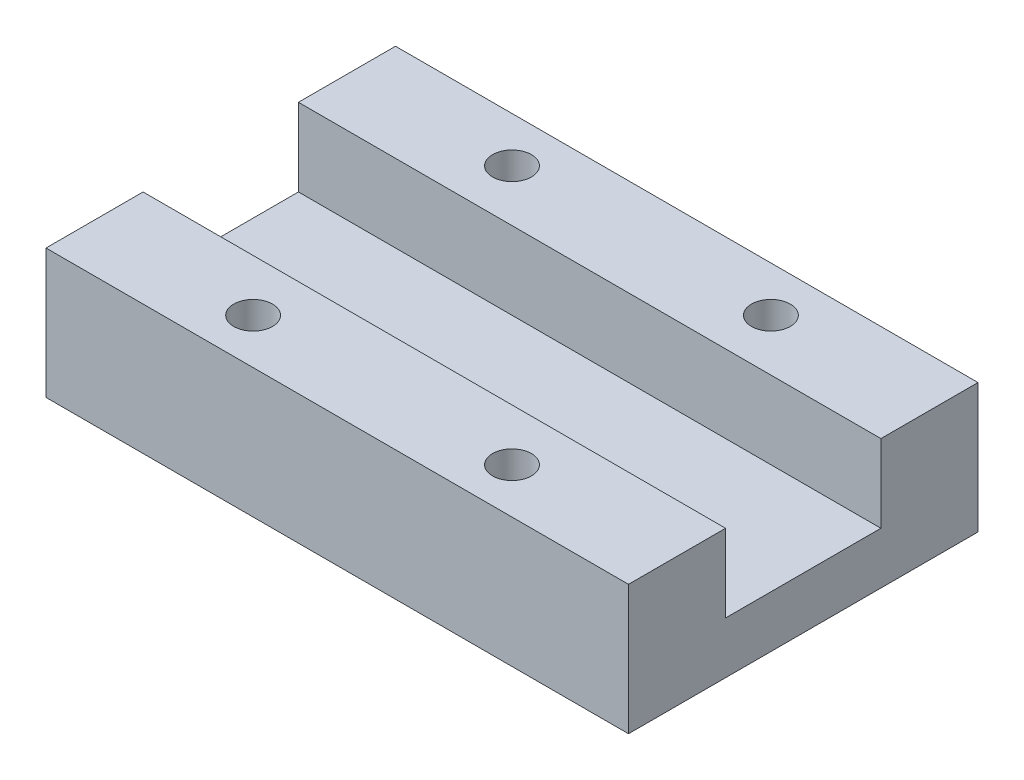
ISO-10303-21;
HEADER;
FILE_DESCRIPTION(('STEP AP214'),'2;1');
FILE_NAME('part.step','',(''),(''),'','','');
FILE_SCHEMA(('AUTOMOTIVE_DESIGN { 1 0 10303 214 1 1 1 1 }'));
ENDSEC;
DATA;
#1=APPLICATION_CONTEXT('core data for automotive mechanical design processes');
#2=APPLICATION_PROTOCOL_DEFINITION('international standard','automotive_design',2000,#1);
#3=PRODUCT_CONTEXT('',#1,'mechanical');
#4=PRODUCT('Part','Part','',(#3));
#5=PRODUCT_RELATED_PRODUCT_CATEGORY('part','',(#4));
#6=PRODUCT_DEFINITION_FORMATION('','',#4);
#7=PRODUCT_DEFINITION_CONTEXT('part definition',#1,'design');
#8=PRODUCT_DEFINITION('design','',#6,#7);
#9=PRODUCT_DEFINITION_SHAPE('','',#8);
#10=(LENGTH_UNIT() NAMED_UNIT(*) SI_UNIT(.MILLI.,.METRE.));
#11=(NAMED_UNIT(*) PLANE_ANGLE_UNIT() SI_UNIT($,.RADIAN.));
#12=(NAMED_UNIT(*) SI_UNIT($,.STERADIAN.) SOLID_ANGLE_UNIT());
#13=UNCERTAINTY_MEASURE_WITH_UNIT(LENGTH_MEASURE(1.E-05),#10,'distance_accuracy_value','');
#14=(GEOMETRIC_REPRESENTATION_CONTEXT(3) GLOBAL_UNCERTAINTY_ASSIGNED_CONTEXT((#13)) GLOBAL_UNIT_ASSIGNED_CONTEXT((#10,
#11,#12)) REPRESENTATION_CONTEXT('',''));
#15=CARTESIAN_POINT('',(0.,0.,0.));
#16=DIRECTION('',(0.,0.,1.));
#17=DIRECTION('',(1.,0.,0.));
#18=AXIS2_PLACEMENT_3D('',#15,#16,#17);
#19=CARTESIAN_POINT('',(45.,10.,0.));
#20=DIRECTION('',(0.,0.,-1.));
#21=DIRECTION('',(-1.,0.,0.));
#22=AXIS2_PLACEMENT_3D('',#19,#20,#21);
#23=PLANE('',#22);
#24=DIRECTION('',(0.,-1.,0.));
#25=VECTOR('',#24,1.);
#26=CARTESIAN_POINT('',(0.,10.,0.));
#27=LINE('',#26,#25);
#28=CARTESIAN_POINT('',(0.,10.,0.));
#29=VERTEX_POINT('',#28);
#30=CARTESIAN_POINT('',(0.,0.,0.));
#31=VERTEX_POINT('',#30);
#32=EDGE_CURVE('E148',#29,#31,#27,.T.);
#33=ORIENTED_EDGE('',*,*,#32,.T.);
#34=DIRECTION('',(-1.,0.,0.));
#35=VECTOR('',#34,1.);
#36=CARTESIAN_POINT('',(45.,0.,0.));
#37=LINE('',#36,#35);
#38=CARTESIAN_POINT('',(45.,0.,0.));
#39=VERTEX_POINT('',#38);
#40=EDGE_CURVE('E11',#39,#31,#37,.T.);
#41=ORIENTED_EDGE('',*,*,#40,.F.);
#42=DIRECTION('',(0.,-1.,0.));
#43=VECTOR('',#42,1.);
#44=CARTESIAN_POINT('',(45.,10.,0.));
#45=LINE('',#44,#43);
#46=CARTESIAN_POINT('',(45.,10.,0.));
#47=VERTEX_POINT('',#46);
#48=EDGE_CURVE('E170',#47,#39,#45,.T.);
#49=ORIENTED_EDGE('',*,*,#48,.F.);
#50=DIRECTION('',(-1.,0.,0.));
#51=VECTOR('',#50,1.);
#52=CARTESIAN_POINT('',(45.,10.,0.));
#53=LINE('',#52,#51);
#54=EDGE_CURVE('E144',#47,#29,#53,.T.);
#55=ORIENTED_EDGE('',*,*,#54,.T.);
#56=EDGE_LOOP('',(#33,#41,#49,#55));
#57=FACE_BOUND('',#56,.T.);
#58=ADVANCED_FACE('F45',(#57),#23,.F.);
#59=CARTESIAN_POINT('',(45.,0.,0.));
#60=DIRECTION('',(0.,1.,0.));
#61=DIRECTION('',(0.,0.,1.));
#62=AXIS2_PLACEMENT_3D('',#59,#60,#61);
#63=PLANE('',#62);
#64=CARTESIAN_POINT('',(12.5,0.,-3.5));
#65=DIRECTION('',(0.,-1.,0.));
#66=DIRECTION('',(0.,0.,-1.));
#67=AXIS2_PLACEMENT_3D('',#64,#65,#66);
#68=CIRCLE('',#67,1.5);
#69=CARTESIAN_POINT('',(12.5,0.,-5.));
#70=VERTEX_POINT('',#69);
#71=EDGE_CURVE('E256',#70,#70,#68,.T.);
#72=ORIENTED_EDGE('',*,*,#71,.F.);
#73=EDGE_LOOP('',(#72));
#74=FACE_BOUND('',#73,.T.);
#75=CARTESIAN_POINT('',(12.5,0.,-23.5));
#76=DIRECTION('',(0.,-1.,0.));
#77=DIRECTION('',(0.,0.,-1.));
#78=AXIS2_PLACEMENT_3D('',#75,#76,#77);
#79=CIRCLE('',#78,1.5);
#80=CARTESIAN_POINT('',(12.5,0.,-25.));
#81=VERTEX_POINT('',#80);
#82=EDGE_CURVE('E260',#81,#81,#79,.T.);
#83=ORIENTED_EDGE('',*,*,#82,.F.);
#84=EDGE_LOOP('',(#83));
#85=FACE_BOUND('',#84,.T.);
#86=CARTESIAN_POINT('',(32.5,0.,-23.5));
#87=DIRECTION('',(0.,-1.,0.));
#88=DIRECTION('',(0.,0.,-1.));
#89=AXIS2_PLACEMENT_3D('',#86,#87,#88);
#90=CIRCLE('',#89,1.5);
#91=CARTESIAN_POINT('',(32.5,0.,-25.));
#92=VERTEX_POINT('',#91);
#93=EDGE_CURVE('E255',#92,#92,#90,.T.);
#94=ORIENTED_EDGE('',*,*,#93,.F.);
#95=EDGE_LOOP('',(#94));
#96=FACE_BOUND('',#95,.T.);
#97=CARTESIAN_POINT('',(32.5,0.,-3.5));
#98=DIRECTION('',(0.,-1.,0.));
#99=DIRECTION('',(0.,0.,-1.));
#100=AXIS2_PLACEMENT_3D('',#97,#98,#99);
#101=CIRCLE('',#100,1.5);
#102=CARTESIAN_POINT('',(32.5,0.,-5.));
#103=VERTEX_POINT('',#102);
#104=EDGE_CURVE('E193',#103,#103,#101,.T.);
#105=ORIENTED_EDGE('',*,*,#104,.F.);
#106=EDGE_LOOP('',(#105));
#107=FACE_BOUND('',#106,.T.);
#108=DIRECTION('',(0.,0.,-1.));
#109=VECTOR('',#108,1.);
#110=CARTESIAN_POINT('',(0.,0.,0.));
#111=LINE('',#110,#109);
#112=CARTESIAN_POINT('',(0.,0.,-27.));
#113=VERTEX_POINT('',#112);
#114=EDGE_CURVE('E152',#31,#113,#111,.T.);
#115=ORIENTED_EDGE('',*,*,#114,.T.);
#116=DIRECTION('',(-1.,0.,0.));
#117=VECTOR('',#116,1.);
#118=CARTESIAN_POINT('',(45.,0.,-27.));
#119=LINE('',#118,#117);
#120=CARTESIAN_POINT('',(45.,0.,-27.));
#121=VERTEX_POINT('',#120);
#122=EDGE_CURVE('E55',#121,#113,#119,.T.);
#123=ORIENTED_EDGE('',*,*,#122,.F.);
#124=DIRECTION('',(0.,0.,-1.));
#125=VECTOR('',#124,1.);
#126=CARTESIAN_POINT('',(45.,0.,0.));
#127=LINE('',#126,#125);
#128=EDGE_CURVE('E107',#39,#121,#127,.T.);
#129=ORIENTED_EDGE('',*,*,#128,.F.);
#130=ORIENTED_EDGE('',*,*,#40,.T.);
#131=EDGE_LOOP('',(#115,#123,#129,#130));
#132=FACE_BOUND('',#131,.T.);
#133=ADVANCED_FACE('F221',(#74,#85,#96,#107,#132),#63,.F.);
#134=CARTESIAN_POINT('',(45.,0.,-27.));
#135=DIRECTION('',(0.,0.,1.));
#136=DIRECTION('',(0.,-1.,0.));
#137=AXIS2_PLACEMENT_3D('',#134,#135,#136);
#138=PLANE('',#137);
#139=DIRECTION('',(0.,1.,0.));
#140=VECTOR('',#139,1.);
#141=CARTESIAN_POINT('',(0.,0.,-27.));
#142=LINE('',#141,#140);
#143=CARTESIAN_POINT('',(0.,10.,-27.));
#144=VERTEX_POINT('',#143);
#145=EDGE_CURVE('E155',#113,#144,#142,.T.);
#146=ORIENTED_EDGE('',*,*,#145,.T.);
#147=DIRECTION('',(-1.,0.,0.));
#148=VECTOR('',#147,1.);
#149=CARTESIAN_POINT('',(45.,10.,-27.));
#150=LINE('',#149,#148);
#151=CARTESIAN_POINT('',(45.,10.,-27.));
#152=VERTEX_POINT('',#151);
#153=EDGE_CURVE('E181',#152,#144,#150,.T.);
#154=ORIENTED_EDGE('',*,*,#153,.F.);
#155=DIRECTION('',(0.,1.,0.));
#156=VECTOR('',#155,1.);
#157=CARTESIAN_POINT('',(45.,0.,-27.));
#158=LINE('',#157,#156);
#159=EDGE_CURVE('E239',#121,#152,#158,.T.);
#160=ORIENTED_EDGE('',*,*,#159,.F.);
#161=ORIENTED_EDGE('',*,*,#122,.T.);
#162=EDGE_LOOP('',(#146,#154,#160,#161));
#163=FACE_BOUND('',#162,.T.);
#164=ADVANCED_FACE('F227',(#163),#138,.F.);
#165=CARTESIAN_POINT('',(45.,10.,-27.));
#166=DIRECTION('',(0.,-1.,0.));
#167=DIRECTION('',(0.,0.,-1.));
#168=AXIS2_PLACEMENT_3D('',#165,#166,#167);
#169=PLANE('',#168);
#170=CARTESIAN_POINT('',(12.5,10.,-23.5));
#171=DIRECTION('',(0.,-1.,0.));
#172=DIRECTION('',(0.,0.,-1.));
#173=AXIS2_PLACEMENT_3D('',#170,#171,#172);
#174=CIRCLE('',#173,1.5);
#175=CARTESIAN_POINT('',(12.5,10.,-25.));
#176=VERTEX_POINT('',#175);
#177=EDGE_CURVE('E48',#176,#176,#174,.T.);
#178=ORIENTED_EDGE('',*,*,#177,.T.);
#179=EDGE_LOOP('',(#178));
#180=FACE_BOUND('',#179,.T.);
#181=CARTESIAN_POINT('',(32.5,10.,-23.5));
#182=DIRECTION('',(0.,-1.,0.));
#183=DIRECTION('',(0.,0.,-1.));
#184=AXIS2_PLACEMENT_3D('',#181,#182,#183);
#185=CIRCLE('',#184,1.5);
#186=CARTESIAN_POINT('',(32.5,10.,-25.));
#187=VERTEX_POINT('',#186);
#188=EDGE_CURVE('E196',#187,#187,#185,.T.);
#189=ORIENTED_EDGE('',*,*,#188,.T.);
#190=EDGE_LOOP('',(#189));
#191=FACE_BOUND('',#190,.T.);
#192=DIRECTION('',(0.,0.,1.));
#193=VECTOR('',#192,1.);
#194=CARTESIAN_POINT('',(0.,10.,-27.));
#195=LINE('',#194,#193);
#196=CARTESIAN_POINT('',(0.,10.,-19.5));
#197=VERTEX_POINT('',#196);
#198=EDGE_CURVE('E158',#144,#197,#195,.T.);
#199=ORIENTED_EDGE('',*,*,#198,.T.);
#200=DIRECTION('',(-1.,0.,0.));
#201=VECTOR('',#200,1.);
#202=CARTESIAN_POINT('',(45.,10.,-19.5));
#203=LINE('',#202,#201);
#204=CARTESIAN_POINT('',(45.,10.,-19.5));
#205=VERTEX_POINT('',#204);
#206=EDGE_CURVE('E177',#205,#197,#203,.T.);
#207=ORIENTED_EDGE('',*,*,#206,.F.);
#208=DIRECTION('',(0.,0.,1.));
#209=VECTOR('',#208,1.);
#210=CARTESIAN_POINT('',(45.,10.,-27.));
#211=LINE('',#210,#209);
#212=EDGE_CURVE('E242',#152,#205,#211,.T.);
#213=ORIENTED_EDGE('',*,*,#212,.F.);
#214=ORIENTED_EDGE('',*,*,#153,.T.);
#215=EDGE_LOOP('',(#199,#207,#213,#214));
#216=FACE_BOUND('',#215,.T.);
#217=ADVANCED_FACE('F205',(#180,#191,#216),#169,.F.);
#218=CARTESIAN_POINT('',(45.,10.,-19.5));
#219=DIRECTION('',(0.,0.,-1.));
#220=DIRECTION('',(-1.,0.,0.));
#221=AXIS2_PLACEMENT_3D('',#218,#219,#220);
#222=PLANE('',#221);
#223=DIRECTION('',(0.,-1.,0.));
#224=VECTOR('',#223,1.);
#225=CARTESIAN_POINT('',(0.,10.,-19.5));
#226=LINE('',#225,#224);
#227=CARTESIAN_POINT('',(0.,4.,-19.5));
#228=VERTEX_POINT('',#227);
#229=EDGE_CURVE('E161',#197,#228,#226,.T.);
#230=ORIENTED_EDGE('',*,*,#229,.T.);
#231=DIRECTION('',(-1.,0.,0.));
#232=VECTOR('',#231,1.);
#233=CARTESIAN_POINT('',(45.,4.,-19.5));
#234=LINE('',#233,#232);
#235=CARTESIAN_POINT('',(45.,4.,-19.5));
#236=VERTEX_POINT('',#235);
#237=EDGE_CURVE('E137',#236,#228,#234,.T.);
#238=ORIENTED_EDGE('',*,*,#237,.F.);
#239=DIRECTION('',(0.,-1.,0.));
#240=VECTOR('',#239,1.);
#241=CARTESIAN_POINT('',(45.,10.,-19.5));
#242=LINE('',#241,#240);
#243=EDGE_CURVE('E126',#205,#236,#242,.T.);
#244=ORIENTED_EDGE('',*,*,#243,.F.);
#245=ORIENTED_EDGE('',*,*,#206,.T.);
#246=EDGE_LOOP('',(#230,#238,#244,#245));
#247=FACE_BOUND('',#246,.T.);
#248=ADVANCED_FACE('F292',(#247),#222,.F.);
#249=CARTESIAN_POINT('',(45.,4.,-19.5));
#250=DIRECTION('',(0.,-1.,0.));
#251=DIRECTION('',(0.,0.,-1.));
#252=AXIS2_PLACEMENT_3D('',#249,#250,#251);
#253=PLANE('',#252);
#254=DIRECTION('',(0.,0.,1.));
#255=VECTOR('',#254,1.);
#256=CARTESIAN_POINT('',(0.,4.,-19.5));
#257=LINE('',#256,#255);
#258=CARTESIAN_POINT('',(0.,4.,-7.5));
#259=VERTEX_POINT('',#258);
#260=EDGE_CURVE('E135',#228,#259,#257,.T.);
#261=ORIENTED_EDGE('',*,*,#260,.T.);
#262=DIRECTION('',(-1.,0.,0.));
#263=VECTOR('',#262,1.);
#264=CARTESIAN_POINT('',(45.,4.,-7.5));
#265=LINE('',#264,#263);
#266=CARTESIAN_POINT('',(45.,4.,-7.5));
#267=VERTEX_POINT('',#266);
#268=EDGE_CURVE('E132',#267,#259,#265,.T.);
#269=ORIENTED_EDGE('',*,*,#268,.F.);
#270=DIRECTION('',(0.,0.,1.));
#271=VECTOR('',#270,1.);
#272=CARTESIAN_POINT('',(45.,4.,-19.5));
#273=LINE('',#272,#271);
#274=EDGE_CURVE('E120',#236,#267,#273,.T.);
#275=ORIENTED_EDGE('',*,*,#274,.F.);
#276=ORIENTED_EDGE('',*,*,#237,.T.);
#277=EDGE_LOOP('',(#261,#269,#275,#276));
#278=FACE_BOUND('',#277,.T.);
#279=ADVANCED_FACE('F133',(#278),#253,.F.);
#280=CARTESIAN_POINT('',(45.,4.,-7.5));
#281=DIRECTION('',(0.,0.,1.));
#282=DIRECTION('',(1.,0.,0.));
#283=AXIS2_PLACEMENT_3D('',#280,#281,#282);
#284=PLANE('',#283);
#285=DIRECTION('',(0.,1.,0.));
#286=VECTOR('',#285,1.);
#287=CARTESIAN_POINT('',(0.,4.,-7.5));
#288=LINE('',#287,#286);
#289=CARTESIAN_POINT('',(0.,10.,-7.5));
#290=VERTEX_POINT('',#289);
#291=EDGE_CURVE('E93',#259,#290,#288,.T.);
#292=ORIENTED_EDGE('',*,*,#291,.T.);
#293=DIRECTION('',(-1.,0.,0.));
#294=VECTOR('',#293,1.);
#295=CARTESIAN_POINT('',(45.,10.,-7.5));
#296=LINE('',#295,#294);
#297=CARTESIAN_POINT('',(45.,10.,-7.5));
#298=VERTEX_POINT('',#297);
#299=EDGE_CURVE('E138',#298,#290,#296,.T.);
#300=ORIENTED_EDGE('',*,*,#299,.F.);
#301=DIRECTION('',(0.,1.,0.));
#302=VECTOR('',#301,1.);
#303=CARTESIAN_POINT('',(45.,4.,-7.5));
#304=LINE('',#303,#302);
#305=EDGE_CURVE('E124',#267,#298,#304,.T.);
#306=ORIENTED_EDGE('',*,*,#305,.F.);
#307=ORIENTED_EDGE('',*,*,#268,.T.);
#308=EDGE_LOOP('',(#292,#300,#306,#307));
#309=FACE_BOUND('',#308,.T.);
#310=ADVANCED_FACE('F140',(#309),#284,.F.);
#311=CARTESIAN_POINT('',(45.,10.,-7.5));
#312=DIRECTION('',(0.,-1.,0.));
#313=DIRECTION('',(0.,0.,-1.));
#314=AXIS2_PLACEMENT_3D('',#311,#312,#313);
#315=PLANE('',#314);
#316=CARTESIAN_POINT('',(12.5,10.,-3.5));
#317=DIRECTION('',(0.,-1.,0.));
#318=DIRECTION('',(0.,0.,-1.));
#319=AXIS2_PLACEMENT_3D('',#316,#317,#318);
#320=CIRCLE('',#319,1.5);
#321=CARTESIAN_POINT('',(12.5,10.,-5.));
#322=VERTEX_POINT('',#321);
#323=EDGE_CURVE('E192',#322,#322,#320,.T.);
#324=ORIENTED_EDGE('',*,*,#323,.T.);
#325=EDGE_LOOP('',(#324));
#326=FACE_BOUND('',#325,.T.);
#327=CARTESIAN_POINT('',(32.5,10.,-3.5));
#328=DIRECTION('',(0.,-1.,0.));
#329=DIRECTION('',(0.,0.,-1.));
#330=AXIS2_PLACEMENT_3D('',#327,#328,#329);
#331=CIRCLE('',#330,1.5);
#332=CARTESIAN_POINT('',(32.5,10.,-5.));
#333=VERTEX_POINT('',#332);
#334=EDGE_CURVE('E188',#333,#333,#331,.T.);
#335=ORIENTED_EDGE('',*,*,#334,.T.);
#336=EDGE_LOOP('',(#335));
#337=FACE_BOUND('',#336,.T.);
#338=DIRECTION('',(0.,0.,1.));
#339=VECTOR('',#338,1.);
#340=CARTESIAN_POINT('',(0.,10.,-7.5));
#341=LINE('',#340,#339);
#342=EDGE_CURVE('E99',#290,#29,#341,.T.);
#343=ORIENTED_EDGE('',*,*,#342,.T.);
#344=ORIENTED_EDGE('',*,*,#54,.F.);
#345=DIRECTION('',(0.,0.,1.));
#346=VECTOR('',#345,1.);
#347=CARTESIAN_POINT('',(45.,10.,-7.5));
#348=LINE('',#347,#346);
#349=EDGE_CURVE('E64',#298,#47,#348,.T.);
#350=ORIENTED_EDGE('',*,*,#349,.F.);
#351=ORIENTED_EDGE('',*,*,#299,.T.);
#352=EDGE_LOOP('',(#343,#344,#350,#351));
#353=FACE_BOUND('',#352,.T.);
#354=ADVANCED_FACE('F277',(#326,#337,#353),#315,.F.);
#355=CARTESIAN_POINT('',(45.,0.,0.));
#356=DIRECTION('',(1.,0.,0.));
#357=DIRECTION('',(0.,0.,-1.));
#358=AXIS2_PLACEMENT_3D('',#355,#356,#357);
#359=PLANE('',#358);
#360=ORIENTED_EDGE('',*,*,#48,.T.);
#361=ORIENTED_EDGE('',*,*,#128,.T.);
#362=ORIENTED_EDGE('',*,*,#159,.T.);
#363=ORIENTED_EDGE('',*,*,#212,.T.);
#364=ORIENTED_EDGE('',*,*,#243,.T.);
#365=ORIENTED_EDGE('',*,*,#274,.T.);
#366=ORIENTED_EDGE('',*,*,#305,.T.);
#367=ORIENTED_EDGE('',*,*,#349,.T.);
#368=EDGE_LOOP('',(#360,#361,#362,#363,#364,#365,#366,#367));
#369=FACE_BOUND('',#368,.T.);
#370=ADVANCED_FACE('F122',(#369),#359,.T.);
#371=CARTESIAN_POINT('',(0.,0.,0.));
#372=DIRECTION('',(1.,0.,0.));
#373=DIRECTION('',(0.,0.,-1.));
#374=AXIS2_PLACEMENT_3D('',#371,#372,#373);
#375=PLANE('',#374);
#376=ORIENTED_EDGE('',*,*,#32,.F.);
#377=ORIENTED_EDGE('',*,*,#342,.F.);
#378=ORIENTED_EDGE('',*,*,#291,.F.);
#379=ORIENTED_EDGE('',*,*,#260,.F.);
#380=ORIENTED_EDGE('',*,*,#229,.F.);
#381=ORIENTED_EDGE('',*,*,#198,.F.);
#382=ORIENTED_EDGE('',*,*,#145,.F.);
#383=ORIENTED_EDGE('',*,*,#114,.F.);
#384=EDGE_LOOP('',(#376,#377,#378,#379,#380,#381,#382,#383));
#385=FACE_BOUND('',#384,.T.);
#386=ADVANCED_FACE('F233',(#385),#375,.F.);
#387=CARTESIAN_POINT('',(32.5,45.,-3.5));
#388=DIRECTION('',(0.,-1.,0.));
#389=DIRECTION('',(0.,0.,-1.));
#390=AXIS2_PLACEMENT_3D('',#387,#388,#389);
#391=CYLINDRICAL_SURFACE('',#390,1.5);
#392=CARTESIAN_POINT('',(32.5,0.,-5.));
#393=CARTESIAN_POINT('',(32.5,0.104166666666674,-5.));
#394=CARTESIAN_POINT('',(32.5,0.20833333333334,-5.));
#395=CARTESIAN_POINT('',(32.5,0.416666666666674,-5.));
#396=CARTESIAN_POINT('',(32.5,0.520833333333341,-5.));
#397=CARTESIAN_POINT('',(32.5,0.729166666666674,-5.));
#398=CARTESIAN_POINT('',(32.5,0.833333333333341,-5.));
#399=CARTESIAN_POINT('',(32.5,1.04166666666667,-5.));
#400=CARTESIAN_POINT('',(32.5,1.14583333333334,-5.));
#401=CARTESIAN_POINT('',(32.5,1.35416666666667,-5.));
#402=CARTESIAN_POINT('',(32.5,1.45833333333334,-5.));
#403=CARTESIAN_POINT('',(32.5,1.66666666666667,-5.));
#404=CARTESIAN_POINT('',(32.5,1.77083333333334,-5.));
#405=CARTESIAN_POINT('',(32.5,1.97916666666668,-5.));
#406=CARTESIAN_POINT('',(32.5,2.08333333333334,-5.));
#407=CARTESIAN_POINT('',(32.5,2.29166666666668,-5.));
#408=CARTESIAN_POINT('',(32.5,2.39583333333334,-5.));
#409=CARTESIAN_POINT('',(32.5,2.60416666666668,-5.));
#410=CARTESIAN_POINT('',(32.5,2.70833333333334,-5.));
#411=CARTESIAN_POINT('',(32.5,2.91666666666668,-5.));
#412=CARTESIAN_POINT('',(32.5,3.02083333333334,-5.));
#413=CARTESIAN_POINT('',(32.5,3.22916666666668,-5.));
#414=CARTESIAN_POINT('',(32.5,3.33333333333334,-5.));
#415=CARTESIAN_POINT('',(32.5,3.54166666666668,-5.));
#416=CARTESIAN_POINT('',(32.5,3.64583333333334,-5.));
#417=CARTESIAN_POINT('',(32.5,3.85416666666668,-5.));
#418=CARTESIAN_POINT('',(32.5,3.95833333333334,-5.));
#419=CARTESIAN_POINT('',(32.5,4.16666666666668,-5.));
#420=CARTESIAN_POINT('',(32.5,4.27083333333334,-5.));
#421=CARTESIAN_POINT('',(32.5,4.47916666666668,-5.));
#422=CARTESIAN_POINT('',(32.5,4.58333333333334,-5.));
#423=CARTESIAN_POINT('',(32.5,4.79166666666668,-5.));
#424=CARTESIAN_POINT('',(32.5,4.89583333333334,-5.));
#425=CARTESIAN_POINT('',(32.5,5.10416666666668,-5.));
#426=CARTESIAN_POINT('',(32.5,5.20833333333335,-5.));
#427=CARTESIAN_POINT('',(32.5,5.41666666666668,-5.));
#428=CARTESIAN_POINT('',(32.5,5.52083333333335,-5.));
#429=CARTESIAN_POINT('',(32.5,5.72916666666668,-5.));
#430=CARTESIAN_POINT('',(32.5,5.83333333333335,-5.));
#431=CARTESIAN_POINT('',(32.5,6.04166666666668,-5.));
#432=CARTESIAN_POINT('',(32.5,6.14583333333335,-5.));
#433=CARTESIAN_POINT('',(32.5,6.35416666666668,-5.));
#434=CARTESIAN_POINT('',(32.5,6.45833333333335,-5.));
#435=CARTESIAN_POINT('',(32.5,6.66666666666668,-5.));
#436=CARTESIAN_POINT('',(32.5,6.77083333333335,-5.));
#437=CARTESIAN_POINT('',(32.5,6.97916666666668,-5.));
#438=CARTESIAN_POINT('',(32.5,7.08333333333335,-5.));
#439=CARTESIAN_POINT('',(32.5,7.29166666666668,-5.));
#440=CARTESIAN_POINT('',(32.5,7.39583333333335,-5.));
#441=CARTESIAN_POINT('',(32.5,7.60416666666668,-5.));
#442=CARTESIAN_POINT('',(32.5,7.70833333333335,-5.));
#443=CARTESIAN_POINT('',(32.5,7.91666666666668,-5.));
#444=CARTESIAN_POINT('',(32.5,8.02083333333335,-5.));
#445=CARTESIAN_POINT('',(32.5,8.22916666666668,-5.));
#446=CARTESIAN_POINT('',(32.5,8.33333333333335,-5.));
#447=CARTESIAN_POINT('',(32.5,8.54166666666668,-5.));
#448=CARTESIAN_POINT('',(32.5,8.64583333333335,-5.));
#449=CARTESIAN_POINT('',(32.5,8.85416666666668,-5.));
#450=CARTESIAN_POINT('',(32.5,8.95833333333335,-5.));
#451=CARTESIAN_POINT('',(32.5,9.16666666666668,-5.));
#452=CARTESIAN_POINT('',(32.5,9.27083333333335,-5.));
#453=CARTESIAN_POINT('',(32.5,9.47916666666668,-5.));
#454=CARTESIAN_POINT('',(32.5,9.58333333333335,-5.));
#455=CARTESIAN_POINT('',(32.5,9.79166666666668,-5.));
#456=CARTESIAN_POINT('',(32.5,9.89583333333335,-5.));
#457=CARTESIAN_POINT('',(32.5,10.,-5.));
#458=B_SPLINE_CURVE_WITH_KNOTS('',3,(#392,#393,#394,#395,#396,#397,#398,#399,#400,#401,#402,
#403,#404,#405,#406,#407,#408,#409,#410,#411,#412,#413,#414,#415,#416,#417,#418,#419,#420,#421,
#422,#423,#424,#425,#426,#427,#428,#429,#430,#431,#432,#433,#434,#435,#436,#437,#438,#439,#440,
#441,#442,#443,#444,#445,#446,#447,#448,#449,#450,#451,#452,#453,#454,#455,#456,#457),
.UNSPECIFIED.,.F.,.F.,(4,2,2,2,2,2,2,2,2,2,2,2,2,2,2,2,2,2,2,2,2,2,2,2,2,2,2,2,2,2,2,2,4),(0.,
0.3125,0.625000000000001,0.937500000000001,1.25,1.5625,1.875,2.1875,2.5,2.8125,3.125,3.4375,
3.75,4.0625,4.375,4.6875,5.,5.3125,5.62500000000001,5.93750000000001,6.25000000000001,
6.56250000000001,6.87500000000001,7.18750000000001,7.50000000000001,7.81250000000001,
8.12500000000001,8.43750000000001,8.75000000000001,9.06250000000001,9.37500000000001,
9.68750000000001,10.),.UNSPECIFIED.);
#459=EDGE_CURVE('BSEAM271',#103,#333,#458,.T.);
#460=ORIENTED_EDGE('',*,*,#104,.T.);
#461=ORIENTED_EDGE('',*,*,#334,.F.);
#462=ORIENTED_EDGE('',*,*,#459,.T.);
#463=ORIENTED_EDGE('',*,*,#459,.F.);
#464=EDGE_LOOP('',(#460,#462,#461,#463));
#465=FACE_BOUND('',#464,.T.);
#466=ADVANCED_FACE('F271',(#465),#391,.F.);
#467=CARTESIAN_POINT('',(12.5,45.,-3.5));
#468=DIRECTION('',(0.,-1.,0.));
#469=DIRECTION('',(0.,0.,-1.));
#470=AXIS2_PLACEMENT_3D('',#467,#468,#469);
#471=CYLINDRICAL_SURFACE('',#470,1.5);
#472=CARTESIAN_POINT('',(12.5,0.,-5.));
#473=CARTESIAN_POINT('',(12.5,0.104166666666674,-5.));
#474=CARTESIAN_POINT('',(12.5,0.20833333333334,-5.));
#475=CARTESIAN_POINT('',(12.5,0.416666666666674,-5.));
#476=CARTESIAN_POINT('',(12.5,0.520833333333341,-5.));
#477=CARTESIAN_POINT('',(12.5,0.729166666666674,-5.));
#478=CARTESIAN_POINT('',(12.5,0.833333333333341,-5.));
#479=CARTESIAN_POINT('',(12.5,1.04166666666667,-5.));
#480=CARTESIAN_POINT('',(12.5,1.14583333333334,-5.));
#481=CARTESIAN_POINT('',(12.5,1.35416666666667,-5.));
#482=CARTESIAN_POINT('',(12.5,1.45833333333334,-5.));
#483=CARTESIAN_POINT('',(12.5,1.66666666666667,-5.));
#484=CARTESIAN_POINT('',(12.5,1.77083333333334,-5.));
#485=CARTESIAN_POINT('',(12.5,1.97916666666668,-5.));
#486=CARTESIAN_POINT('',(12.5,2.08333333333334,-5.));
#487=CARTESIAN_POINT('',(12.5,2.29166666666668,-5.));
#488=CARTESIAN_POINT('',(12.5,2.39583333333334,-5.));
#489=CARTESIAN_POINT('',(12.5,2.60416666666668,-5.));
#490=CARTESIAN_POINT('',(12.5,2.70833333333334,-5.));
#491=CARTESIAN_POINT('',(12.5,2.91666666666668,-5.));
#492=CARTESIAN_POINT('',(12.5,3.02083333333334,-5.));
#493=CARTESIAN_POINT('',(12.5,3.22916666666668,-5.));
#494=CARTESIAN_POINT('',(12.5,3.33333333333334,-5.));
#495=CARTESIAN_POINT('',(12.5,3.54166666666668,-5.));
#496=CARTESIAN_POINT('',(12.5,3.64583333333334,-5.));
#497=CARTESIAN_POINT('',(12.5,3.85416666666668,-5.));
#498=CARTESIAN_POINT('',(12.5,3.95833333333334,-5.));
#499=CARTESIAN_POINT('',(12.5,4.16666666666668,-5.));
#500=CARTESIAN_POINT('',(12.5,4.27083333333334,-5.));
#501=CARTESIAN_POINT('',(12.5,4.47916666666668,-5.));
#502=CARTESIAN_POINT('',(12.5,4.58333333333334,-5.));
#503=CARTESIAN_POINT('',(12.5,4.79166666666668,-5.));
#504=CARTESIAN_POINT('',(12.5,4.89583333333334,-5.));
#505=CARTESIAN_POINT('',(12.5,5.10416666666668,-5.));
#506=CARTESIAN_POINT('',(12.5,5.20833333333335,-5.));
#507=CARTESIAN_POINT('',(12.5,5.41666666666668,-5.));
#508=CARTESIAN_POINT('',(12.5,5.52083333333335,-5.));
#509=CARTESIAN_POINT('',(12.5,5.72916666666668,-5.));
#510=CARTESIAN_POINT('',(12.5,5.83333333333335,-5.));
#511=CARTESIAN_POINT('',(12.5,6.04166666666668,-5.));
#512=CARTESIAN_POINT('',(12.5,6.14583333333335,-5.));
#513=CARTESIAN_POINT('',(12.5,6.35416666666668,-5.));
#514=CARTESIAN_POINT('',(12.5,6.45833333333335,-5.));
#515=CARTESIAN_POINT('',(12.5,6.66666666666668,-5.));
#516=CARTESIAN_POINT('',(12.5,6.77083333333335,-5.));
#517=CARTESIAN_POINT('',(12.5,6.97916666666668,-5.));
#518=CARTESIAN_POINT('',(12.5,7.08333333333335,-5.));
#519=CARTESIAN_POINT('',(12.5,7.29166666666668,-5.));
#520=CARTESIAN_POINT('',(12.5,7.39583333333335,-5.));
#521=CARTESIAN_POINT('',(12.5,7.60416666666668,-5.));
#522=CARTESIAN_POINT('',(12.5,7.70833333333335,-5.));
#523=CARTESIAN_POINT('',(12.5,7.91666666666668,-5.));
#524=CARTESIAN_POINT('',(12.5,8.02083333333335,-5.));
#525=CARTESIAN_POINT('',(12.5,8.22916666666668,-5.));
#526=CARTESIAN_POINT('',(12.5,8.33333333333335,-5.));
#527=CARTESIAN_POINT('',(12.5,8.54166666666668,-5.));
#528=CARTESIAN_POINT('',(12.5,8.64583333333335,-5.));
#529=CARTESIAN_POINT('',(12.5,8.85416666666668,-5.));
#530=CARTESIAN_POINT('',(12.5,8.95833333333335,-5.));
#531=CARTESIAN_POINT('',(12.5,9.16666666666668,-5.));
#532=CARTESIAN_POINT('',(12.5,9.27083333333335,-5.));
#533=CARTESIAN_POINT('',(12.5,9.47916666666668,-5.));
#534=CARTESIAN_POINT('',(12.5,9.58333333333335,-5.));
#535=CARTESIAN_POINT('',(12.5,9.79166666666668,-5.));
#536=CARTESIAN_POINT('',(12.5,9.89583333333335,-5.));
#537=CARTESIAN_POINT('',(12.5,10.,-5.));
#538=B_SPLINE_CURVE_WITH_KNOTS('',3,(#472,#473,#474,#475,#476,#477,#478,#479,#480,#481,#482,
#483,#484,#485,#486,#487,#488,#489,#490,#491,#492,#493,#494,#495,#496,#497,#498,#499,#500,#501,
#502,#503,#504,#505,#506,#507,#508,#509,#510,#511,#512,#513,#514,#515,#516,#517,#518,#519,#520,
#521,#522,#523,#524,#525,#526,#527,#528,#529,#530,#531,#532,#533,#534,#535,#536,#537),
.UNSPECIFIED.,.F.,.F.,(4,2,2,2,2,2,2,2,2,2,2,2,2,2,2,2,2,2,2,2,2,2,2,2,2,2,2,2,2,2,2,2,4),(0.,
0.3125,0.625000000000001,0.937500000000001,1.25,1.5625,1.875,2.1875,2.5,2.8125,3.125,3.4375,
3.75,4.0625,4.375,4.6875,5.,5.3125,5.62500000000001,5.93750000000001,6.25000000000001,
6.56250000000001,6.87500000000001,7.18750000000001,7.50000000000001,7.81250000000001,
8.12500000000001,8.43750000000001,8.75000000000001,9.06250000000001,9.37500000000001,
9.68750000000001,10.),.UNSPECIFIED.);
#539=EDGE_CURVE('BSEAM215',#70,#322,#538,.T.);
#540=ORIENTED_EDGE('',*,*,#71,.T.);
#541=ORIENTED_EDGE('',*,*,#323,.F.);
#542=ORIENTED_EDGE('',*,*,#539,.T.);
#543=ORIENTED_EDGE('',*,*,#539,.F.);
#544=EDGE_LOOP('',(#540,#542,#541,#543));
#545=FACE_BOUND('',#544,.T.);
#546=ADVANCED_FACE('F215',(#545),#471,.F.);
#547=CARTESIAN_POINT('',(32.5,45.,-23.5));
#548=DIRECTION('',(0.,-1.,0.));
#549=DIRECTION('',(0.,0.,-1.));
#550=AXIS2_PLACEMENT_3D('',#547,#548,#549);
#551=CYLINDRICAL_SURFACE('',#550,1.5);
#552=CARTESIAN_POINT('',(32.5,0.,-25.));
#553=CARTESIAN_POINT('',(32.5,0.104166666666674,-25.));
#554=CARTESIAN_POINT('',(32.5,0.20833333333334,-25.));
#555=CARTESIAN_POINT('',(32.5,0.416666666666674,-25.));
#556=CARTESIAN_POINT('',(32.5,0.520833333333341,-25.));
#557=CARTESIAN_POINT('',(32.5,0.729166666666674,-25.));
#558=CARTESIAN_POINT('',(32.5,0.833333333333341,-25.));
#559=CARTESIAN_POINT('',(32.5,1.04166666666667,-25.));
#560=CARTESIAN_POINT('',(32.5,1.14583333333334,-25.));
#561=CARTESIAN_POINT('',(32.5,1.35416666666667,-25.));
#562=CARTESIAN_POINT('',(32.5,1.45833333333334,-25.));
#563=CARTESIAN_POINT('',(32.5,1.66666666666667,-25.));
#564=CARTESIAN_POINT('',(32.5,1.77083333333334,-25.));
#565=CARTESIAN_POINT('',(32.5,1.97916666666668,-25.));
#566=CARTESIAN_POINT('',(32.5,2.08333333333334,-25.));
#567=CARTESIAN_POINT('',(32.5,2.29166666666668,-25.));
#568=CARTESIAN_POINT('',(32.5,2.39583333333334,-25.));
#569=CARTESIAN_POINT('',(32.5,2.60416666666668,-25.));
#570=CARTESIAN_POINT('',(32.5,2.70833333333334,-25.));
#571=CARTESIAN_POINT('',(32.5,2.91666666666668,-25.));
#572=CARTESIAN_POINT('',(32.5,3.02083333333334,-25.));
#573=CARTESIAN_POINT('',(32.5,3.22916666666668,-25.));
#574=CARTESIAN_POINT('',(32.5,3.33333333333334,-25.));
#575=CARTESIAN_POINT('',(32.5,3.54166666666668,-25.));
#576=CARTESIAN_POINT('',(32.5,3.64583333333334,-25.));
#577=CARTESIAN_POINT('',(32.5,3.85416666666668,-25.));
#578=CARTESIAN_POINT('',(32.5,3.95833333333334,-25.));
#579=CARTESIAN_POINT('',(32.5,4.16666666666668,-25.));
#580=CARTESIAN_POINT('',(32.5,4.27083333333334,-25.));
#581=CARTESIAN_POINT('',(32.5,4.47916666666668,-25.));
#582=CARTESIAN_POINT('',(32.5,4.58333333333334,-25.));
#583=CARTESIAN_POINT('',(32.5,4.79166666666668,-25.));
#584=CARTESIAN_POINT('',(32.5,4.89583333333334,-25.));
#585=CARTESIAN_POINT('',(32.5,5.10416666666668,-25.));
#586=CARTESIAN_POINT('',(32.5,5.20833333333335,-25.));
#587=CARTESIAN_POINT('',(32.5,5.41666666666668,-25.));
#588=CARTESIAN_POINT('',(32.5,5.52083333333335,-25.));
#589=CARTESIAN_POINT('',(32.5,5.72916666666668,-25.));
#590=CARTESIAN_POINT('',(32.5,5.83333333333335,-25.));
#591=CARTESIAN_POINT('',(32.5,6.04166666666668,-25.));
#592=CARTESIAN_POINT('',(32.5,6.14583333333335,-25.));
#593=CARTESIAN_POINT('',(32.5,6.35416666666668,-25.));
#594=CARTESIAN_POINT('',(32.5,6.45833333333335,-25.));
#595=CARTESIAN_POINT('',(32.5,6.66666666666668,-25.));
#596=CARTESIAN_POINT('',(32.5,6.77083333333335,-25.));
#597=CARTESIAN_POINT('',(32.5,6.97916666666668,-25.));
#598=CARTESIAN_POINT('',(32.5,7.08333333333335,-25.));
#599=CARTESIAN_POINT('',(32.5,7.29166666666668,-25.));
#600=CARTESIAN_POINT('',(32.5,7.39583333333335,-25.));
#601=CARTESIAN_POINT('',(32.5,7.60416666666668,-25.));
#602=CARTESIAN_POINT('',(32.5,7.70833333333335,-25.));
#603=CARTESIAN_POINT('',(32.5,7.91666666666668,-25.));
#604=CARTESIAN_POINT('',(32.5,8.02083333333335,-25.));
#605=CARTESIAN_POINT('',(32.5,8.22916666666668,-25.));
#606=CARTESIAN_POINT('',(32.5,8.33333333333335,-25.));
#607=CARTESIAN_POINT('',(32.5,8.54166666666668,-25.));
#608=CARTESIAN_POINT('',(32.5,8.64583333333335,-25.));
#609=CARTESIAN_POINT('',(32.5,8.85416666666668,-25.));
#610=CARTESIAN_POINT('',(32.5,8.95833333333335,-25.));
#611=CARTESIAN_POINT('',(32.5,9.16666666666668,-25.));
#612=CARTESIAN_POINT('',(32.5,9.27083333333335,-25.));
#613=CARTESIAN_POINT('',(32.5,9.47916666666668,-25.));
#614=CARTESIAN_POINT('',(32.5,9.58333333333335,-25.));
#615=CARTESIAN_POINT('',(32.5,9.79166666666668,-25.));
#616=CARTESIAN_POINT('',(32.5,9.89583333333335,-25.));
#617=CARTESIAN_POINT('',(32.5,10.,-25.));
#618=B_SPLINE_CURVE_WITH_KNOTS('',3,(#552,#553,#554,#555,#556,#557,#558,#559,#560,#561,#562,
#563,#564,#565,#566,#567,#568,#569,#570,#571,#572,#573,#574,#575,#576,#577,#578,#579,#580,#581,
#582,#583,#584,#585,#586,#587,#588,#589,#590,#591,#592,#593,#594,#595,#596,#597,#598,#599,#600,
#601,#602,#603,#604,#605,#606,#607,#608,#609,#610,#611,#612,#613,#614,#615,#616,#617),
.UNSPECIFIED.,.F.,.F.,(4,2,2,2,2,2,2,2,2,2,2,2,2,2,2,2,2,2,2,2,2,2,2,2,2,2,2,2,2,2,2,2,4),(0.,
0.3125,0.625000000000001,0.937500000000001,1.25,1.5625,1.875,2.1875,2.5,2.8125,3.125,3.4375,
3.75,4.0625,4.375,4.6875,5.,5.3125,5.62500000000001,5.93750000000001,6.25000000000001,
6.56250000000001,6.87500000000001,7.18750000000001,7.50000000000001,7.81250000000001,
8.12500000000001,8.43750000000001,8.75000000000001,9.06250000000001,9.37500000000001,
9.68750000000001,10.),.UNSPECIFIED.);
#619=EDGE_CURVE('BSEAM209',#92,#187,#618,.T.);
#620=ORIENTED_EDGE('',*,*,#93,.T.);
#621=ORIENTED_EDGE('',*,*,#188,.F.);
#622=ORIENTED_EDGE('',*,*,#619,.T.);
#623=ORIENTED_EDGE('',*,*,#619,.F.);
#624=EDGE_LOOP('',(#620,#622,#621,#623));
#625=FACE_BOUND('',#624,.T.);
#626=ADVANCED_FACE('F209',(#625),#551,.F.);
#627=CARTESIAN_POINT('',(12.5,45.,-23.5));
#628=DIRECTION('',(0.,-1.,0.));
#629=DIRECTION('',(0.,0.,-1.));
#630=AXIS2_PLACEMENT_3D('',#627,#628,#629);
#631=CYLINDRICAL_SURFACE('',#630,1.5);
#632=CARTESIAN_POINT('',(12.5,0.,-25.));
#633=CARTESIAN_POINT('',(12.5,0.104166666666674,-25.));
#634=CARTESIAN_POINT('',(12.5,0.20833333333334,-25.));
#635=CARTESIAN_POINT('',(12.5,0.416666666666674,-25.));
#636=CARTESIAN_POINT('',(12.5,0.520833333333341,-25.));
#637=CARTESIAN_POINT('',(12.5,0.729166666666674,-25.));
#638=CARTESIAN_POINT('',(12.5,0.833333333333341,-25.));
#639=CARTESIAN_POINT('',(12.5,1.04166666666667,-25.));
#640=CARTESIAN_POINT('',(12.5,1.14583333333334,-25.));
#641=CARTESIAN_POINT('',(12.5,1.35416666666667,-25.));
#642=CARTESIAN_POINT('',(12.5,1.45833333333334,-25.));
#643=CARTESIAN_POINT('',(12.5,1.66666666666667,-25.));
#644=CARTESIAN_POINT('',(12.5,1.77083333333334,-25.));
#645=CARTESIAN_POINT('',(12.5,1.97916666666668,-25.));
#646=CARTESIAN_POINT('',(12.5,2.08333333333334,-25.));
#647=CARTESIAN_POINT('',(12.5,2.29166666666668,-25.));
#648=CARTESIAN_POINT('',(12.5,2.39583333333334,-25.));
#649=CARTESIAN_POINT('',(12.5,2.60416666666668,-25.));
#650=CARTESIAN_POINT('',(12.5,2.70833333333334,-25.));
#651=CARTESIAN_POINT('',(12.5,2.91666666666668,-25.));
#652=CARTESIAN_POINT('',(12.5,3.02083333333334,-25.));
#653=CARTESIAN_POINT('',(12.5,3.22916666666668,-25.));
#654=CARTESIAN_POINT('',(12.5,3.33333333333334,-25.));
#655=CARTESIAN_POINT('',(12.5,3.54166666666668,-25.));
#656=CARTESIAN_POINT('',(12.5,3.64583333333334,-25.));
#657=CARTESIAN_POINT('',(12.5,3.85416666666668,-25.));
#658=CARTESIAN_POINT('',(12.5,3.95833333333334,-25.));
#659=CARTESIAN_POINT('',(12.5,4.16666666666668,-25.));
#660=CARTESIAN_POINT('',(12.5,4.27083333333334,-25.));
#661=CARTESIAN_POINT('',(12.5,4.47916666666668,-25.));
#662=CARTESIAN_POINT('',(12.5,4.58333333333334,-25.));
#663=CARTESIAN_POINT('',(12.5,4.79166666666668,-25.));
#664=CARTESIAN_POINT('',(12.5,4.89583333333334,-25.));
#665=CARTESIAN_POINT('',(12.5,5.10416666666668,-25.));
#666=CARTESIAN_POINT('',(12.5,5.20833333333335,-25.));
#667=CARTESIAN_POINT('',(12.5,5.41666666666668,-25.));
#668=CARTESIAN_POINT('',(12.5,5.52083333333335,-25.));
#669=CARTESIAN_POINT('',(12.5,5.72916666666668,-25.));
#670=CARTESIAN_POINT('',(12.5,5.83333333333335,-25.));
#671=CARTESIAN_POINT('',(12.5,6.04166666666668,-25.));
#672=CARTESIAN_POINT('',(12.5,6.14583333333335,-25.));
#673=CARTESIAN_POINT('',(12.5,6.35416666666668,-25.));
#674=CARTESIAN_POINT('',(12.5,6.45833333333335,-25.));
#675=CARTESIAN_POINT('',(12.5,6.66666666666668,-25.));
#676=CARTESIAN_POINT('',(12.5,6.77083333333335,-25.));
#677=CARTESIAN_POINT('',(12.5,6.97916666666668,-25.));
#678=CARTESIAN_POINT('',(12.5,7.08333333333335,-25.));
#679=CARTESIAN_POINT('',(12.5,7.29166666666668,-25.));
#680=CARTESIAN_POINT('',(12.5,7.39583333333335,-25.));
#681=CARTESIAN_POINT('',(12.5,7.60416666666668,-25.));
#682=CARTESIAN_POINT('',(12.5,7.70833333333335,-25.));
#683=CARTESIAN_POINT('',(12.5,7.91666666666668,-25.));
#684=CARTESIAN_POINT('',(12.5,8.02083333333335,-25.));
#685=CARTESIAN_POINT('',(12.5,8.22916666666668,-25.));
#686=CARTESIAN_POINT('',(12.5,8.33333333333335,-25.));
#687=CARTESIAN_POINT('',(12.5,8.54166666666668,-25.));
#688=CARTESIAN_POINT('',(12.5,8.64583333333335,-25.));
#689=CARTESIAN_POINT('',(12.5,8.85416666666668,-25.));
#690=CARTESIAN_POINT('',(12.5,8.95833333333335,-25.));
#691=CARTESIAN_POINT('',(12.5,9.16666666666668,-25.));
#692=CARTESIAN_POINT('',(12.5,9.27083333333335,-25.));
#693=CARTESIAN_POINT('',(12.5,9.47916666666668,-25.));
#694=CARTESIAN_POINT('',(12.5,9.58333333333335,-25.));
#695=CARTESIAN_POINT('',(12.5,9.79166666666668,-25.));
#696=CARTESIAN_POINT('',(12.5,9.89583333333335,-25.));
#697=CARTESIAN_POINT('',(12.5,10.,-25.));
#698=B_SPLINE_CURVE_WITH_KNOTS('',3,(#632,#633,#634,#635,#636,#637,#638,#639,#640,#641,#642,
#643,#644,#645,#646,#647,#648,#649,#650,#651,#652,#653,#654,#655,#656,#657,#658,#659,#660,#661,
#662,#663,#664,#665,#666,#667,#668,#669,#670,#671,#672,#673,#674,#675,#676,#677,#678,#679,#680,
#681,#682,#683,#684,#685,#686,#687,#688,#689,#690,#691,#692,#693,#694,#695,#696,#697),
.UNSPECIFIED.,.F.,.F.,(4,2,2,2,2,2,2,2,2,2,2,2,2,2,2,2,2,2,2,2,2,2,2,2,2,2,2,2,2,2,2,2,4),(0.,
0.3125,0.625000000000001,0.937500000000001,1.25,1.5625,1.875,2.1875,2.5,2.8125,3.125,3.4375,
3.75,4.0625,4.375,4.6875,5.,5.3125,5.62500000000001,5.93750000000001,6.25000000000001,
6.56250000000001,6.87500000000001,7.18750000000001,7.50000000000001,7.81250000000001,
8.12500000000001,8.43750000000001,8.75000000000001,9.06250000000001,9.37500000000001,
9.68750000000001,10.),.UNSPECIFIED.);
#699=EDGE_CURVE('BSEAM207',#81,#176,#698,.T.);
#700=ORIENTED_EDGE('',*,*,#82,.T.);
#701=ORIENTED_EDGE('',*,*,#177,.F.);
#702=ORIENTED_EDGE('',*,*,#699,.T.);
#703=ORIENTED_EDGE('',*,*,#699,.F.);
#704=EDGE_LOOP('',(#700,#702,#701,#703));
#705=FACE_BOUND('',#704,.T.);
#706=ADVANCED_FACE('F207',(#705),#631,.F.);
#707=CLOSED_SHELL('',(#58,#133,#164,#217,#248,#279,#310,#354,#370,#386,#466,#546,#626,#706));
#708=MANIFOLD_SOLID_BREP('B2',#707);
#709=ADVANCED_BREP_SHAPE_REPRESENTATION('',(#18,#708),#14);
#710=SHAPE_DEFINITION_REPRESENTATION(#9,#709);
ENDSEC;
END-ISO-10303-21;
